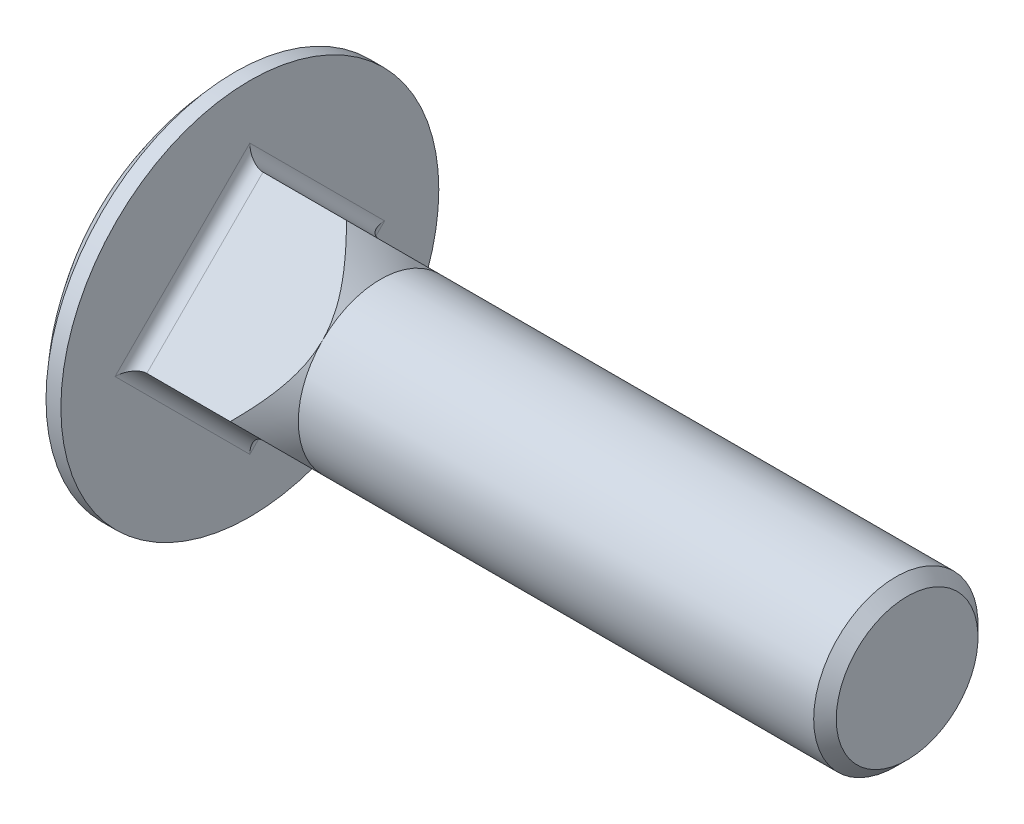
ISO-10303-21;
HEADER;
FILE_DESCRIPTION(('STEP AP214'),'2;1');
FILE_NAME('part.step','',(''),(''),'','','');
FILE_SCHEMA(('AUTOMOTIVE_DESIGN { 1 0 10303 214 1 1 1 1 }'));
ENDSEC;
DATA;
#1=APPLICATION_CONTEXT('core data for automotive mechanical design processes');
#2=APPLICATION_PROTOCOL_DEFINITION('international standard','automotive_design',2000,#1);
#3=PRODUCT_CONTEXT('',#1,'mechanical');
#4=PRODUCT('Part','Part','',(#3));
#5=PRODUCT_RELATED_PRODUCT_CATEGORY('part','',(#4));
#6=PRODUCT_DEFINITION_FORMATION('','',#4);
#7=PRODUCT_DEFINITION_CONTEXT('part definition',#1,'design');
#8=PRODUCT_DEFINITION('design','',#6,#7);
#9=PRODUCT_DEFINITION_SHAPE('','',#8);
#10=(LENGTH_UNIT() NAMED_UNIT(*) SI_UNIT(.MILLI.,.METRE.));
#11=(NAMED_UNIT(*) PLANE_ANGLE_UNIT() SI_UNIT($,.RADIAN.));
#12=(NAMED_UNIT(*) SI_UNIT($,.STERADIAN.) SOLID_ANGLE_UNIT());
#13=UNCERTAINTY_MEASURE_WITH_UNIT(LENGTH_MEASURE(1.E-05),#10,'distance_accuracy_value','');
#14=(GEOMETRIC_REPRESENTATION_CONTEXT(3) GLOBAL_UNCERTAINTY_ASSIGNED_CONTEXT((#13)) GLOBAL_UNIT_ASSIGNED_CONTEXT((#10,
#11,#12)) REPRESENTATION_CONTEXT('',''));
#15=CARTESIAN_POINT('',(0.,0.,0.));
#16=DIRECTION('',(0.,0.,1.));
#17=DIRECTION('',(1.,0.,0.));
#18=AXIS2_PLACEMENT_3D('',#15,#16,#17);
#19=CARTESIAN_POINT('',(26.8,0.,14.1421356237309));
#20=DIRECTION('',(0.,-0.707106781186548,-0.707106781186548));
#21=DIRECTION('',(0.,0.707106781186548,-0.707106781186548));
#22=AXIS2_PLACEMENT_3D('',#19,#20,#21);
#23=PLANE('',#22);
#24=DIRECTION('',(-1.,0.,0.));
#25=VECTOR('',#24,1.);
#26=CARTESIAN_POINT('',(26.8,14.1421356237309,0.));
#27=LINE('',#26,#25);
#28=CARTESIAN_POINT('',(22.6578643762691,14.1421356237309,0.));
#29=VERTEX_POINT('',#28);
#30=CARTESIAN_POINT('',(12.5,14.1421356237309,0.));
#31=VERTEX_POINT('',#30);
#32=EDGE_CURVE('E114',#29,#31,#27,.T.);
#33=ORIENTED_EDGE('',*,*,#32,.T.);
#34=DIRECTION('',(0.,0.707106781186548,-0.707106781186548));
#35=VECTOR('',#34,1.);
#36=CARTESIAN_POINT('',(12.5,0.,14.1421356237309));
#37=LINE('',#36,#35);
#38=CARTESIAN_POINT('',(12.5,0.,14.1421356237309));
#39=VERTEX_POINT('',#38);
#40=EDGE_CURVE('E207',#31,#39,#37,.F.);
#41=ORIENTED_EDGE('',*,*,#40,.T.);
#42=DIRECTION('',(-1.,0.,0.));
#43=VECTOR('',#42,1.);
#44=CARTESIAN_POINT('',(26.8,0.,14.1421356237309));
#45=LINE('',#44,#43);
#46=CARTESIAN_POINT('',(22.6578643762691,0.,14.1421356237309));
#47=VERTEX_POINT('',#46);
#48=EDGE_CURVE('E136',#47,#39,#45,.T.);
#49=ORIENTED_EDGE('',*,*,#48,.F.);
#50=CARTESIAN_POINT('',(22.6576643748549,14.1423356237309,-0.000199999999999029));
#51=CARTESIAN_POINT('',(22.8552392283487,13.9446994666429,0.197436157088054));
#52=CARTESIAN_POINT('',(23.0501556641655,13.7457030921676,0.396432531563339));
#53=CARTESIAN_POINT('',(23.4333984633262,13.3444369594801,0.797698664250814));
#54=CARTESIAN_POINT('',(23.6217218239552,13.1421657695887,0.999969854142291));
#55=CARTESIAN_POINT('',(23.9926271803843,12.7314246407346,1.41071098299635));
#56=CARTESIAN_POINT('',(24.1751080796743,12.5229088328005,1.61922679093046));
#57=CARTESIAN_POINT('',(24.5298995073007,12.1016083728509,2.04052725088003));
#58=CARTESIAN_POINT('',(24.7022111978711,11.8888242124024,2.25331141132851));
#59=CARTESIAN_POINT('',(25.0394769309558,11.4516566328823,2.69047899084863));
#60=CARTESIAN_POINT('',(25.2040327665689,11.2271185346916,2.91501708903939));
#61=CARTESIAN_POINT('',(25.5164765471425,10.7722142378568,3.36992138587418));
#62=CARTESIAN_POINT('',(25.6643613255501,10.5418469421375,3.60028868159347));
#63=CARTESIAN_POINT('',(25.9385679105803,10.0760560019902,4.06607962174076));
#64=CARTESIAN_POINT('',(26.0649930308742,9.84066310428535,4.3014725194456));
#65=CARTESIAN_POINT('',(26.2922366284796,9.36384804521957,4.77828757851138));
#66=CARTESIAN_POINT('',(26.3930711974024,9.1224297781097,5.01970584562125));
#67=CARTESIAN_POINT('',(26.5594298218964,8.64734642981096,5.49478919391998));
#68=CARTESIAN_POINT('',(26.6265684911894,8.41396806419352,5.72816755953743));
#69=CARTESIAN_POINT('',(26.7294988996792,7.94365931944244,6.19847630428851));
#70=CARTESIAN_POINT('',(26.7652837903487,7.70672817577374,6.43540744795721));
#71=CARTESIAN_POINT('',(26.8027880976449,7.23483443639357,6.90730118733738));
#72=CARTESIAN_POINT('',(26.8049784399421,6.99989086408195,7.14224475964899));
#73=CARTESIAN_POINT('',(26.776351053315,6.53102922546276,7.61110639826819));
#74=CARTESIAN_POINT('',(26.7455331671974,6.29711116404425,7.8450244596867));
#75=CARTESIAN_POINT('',(26.6532636480021,5.83397829250257,8.30815733122838));
#76=CARTESIAN_POINT('',(26.5920192159764,5.60474244237851,8.53739318135243));
#77=CARTESIAN_POINT('',(26.4425106057619,5.15076036382533,8.99137525990561));
#78=CARTESIAN_POINT('',(26.3542429126702,4.92601472348903,9.21612090024191));
#79=CARTESIAN_POINT('',(26.153488687891,4.47883245936657,9.66330316436437));
#80=CARTESIAN_POINT('',(26.0407010015051,4.25646429189013,9.88567133184082));
#81=CARTESIAN_POINT('',(25.7957378468811,3.81720389756956,10.3249317261614));
#82=CARTESIAN_POINT('',(25.6635628046939,3.60031155051314,10.5418240732178));
#83=CARTESIAN_POINT('',(25.325134016844,3.08247770866529,11.0596579150657));
#84=CARTESIAN_POINT('',(25.1109497942153,2.78414006303691,11.357995560694));
#85=CARTESIAN_POINT('',(24.6590340381723,2.19639988711076,11.9457357366202));
#86=CARTESIAN_POINT('',(24.4212871839925,1.90700333296593,12.235132290765));
#87=CARTESIAN_POINT('',(24.0552264472503,1.48299272957831,12.6591428941526));
#88=CARTESIAN_POINT('',(23.9336313955666,1.34544247647458,12.7966931472564));
#89=CARTESIAN_POINT('',(23.6868013677934,1.07197750453633,13.0701581191946));
#90=CARTESIAN_POINT('',(23.5615663032384,0.936062825565895,13.2060727981651));
#91=CARTESIAN_POINT('',(23.3081456578953,0.665971150459454,13.4761644732715));
#92=CARTESIAN_POINT('',(23.1799657765101,0.531791473207739,13.6103441505232));
#93=CARTESIAN_POINT('',(22.9208176363549,0.264803454716262,13.8773321690147));
#94=CARTESIAN_POINT('',(22.7898496478111,0.131994982414042,14.0101406413169));
#95=CARTESIAN_POINT('',(22.6576643748549,-0.000200000000001505,14.1423356237309));
#96=B_SPLINE_CURVE_WITH_KNOTS('',3,(#50,#51,#52,#53,#54,#55,#56,#57,#58,#59,#60,#61,#62,#63,#64,
#65,#66,#67,#68,#69,#70,#71,#72,#73,#74,#75,#76,#77,#78,#79,#80,#81,#82,#83,#84,#85,#86,#87,#88,
#89,#90,#91,#92,#93,#94,#95),.UNSPECIFIED.,.F.,.F.,(4,2,2,2,2,2,2,2,2,2,2,2,2,2,2,2,2,2,2,2,2,2,
4),(0.,1.02687972356315,2.05422119567216,3.09439498893963,4.13444967010763,5.20700647683827,
6.27976666632527,7.3472059901858,8.41397242439995,9.42305133747884,10.4323506062297,
11.4274884598788,12.4226310526426,13.4110878709944,14.3996733121294,15.4011657056799,
16.4026360940232,17.8210687220063,19.2404297629662,19.9286061302981,20.6167992368238,
21.3037570942602,21.990648671472),.UNSPECIFIED.);
#97=CARTESIAN_POINT('',(26.8,7.07106781186547,7.07106781186547));
#98=VERTEX_POINT('',#97);
#99=EDGE_CURVE('E115',#98,#47,#96,.T.);
#100=ORIENTED_EDGE('',*,*,#99,.F.);
#101=EDGE_CURVE('E102',#29,#98,#96,.T.);
#102=ORIENTED_EDGE('',*,*,#101,.F.);
#103=EDGE_LOOP('',(#33,#41,#49,#100,#102));
#104=FACE_BOUND('',#103,.T.);
#105=ADVANCED_FACE('F34',(#104),#23,.F.);
#106=CARTESIAN_POINT('',(26.8,-14.1421356237309,0.));
#107=DIRECTION('',(0.,0.707106781186548,-0.707106781186548));
#108=DIRECTION('',(0.,0.707106781186548,0.707106781186548));
#109=AXIS2_PLACEMENT_3D('',#106,#107,#108);
#110=PLANE('',#109);
#111=ORIENTED_EDGE('',*,*,#48,.T.);
#112=DIRECTION('',(0.,0.707106781186548,0.707106781186548));
#113=VECTOR('',#112,1.);
#114=CARTESIAN_POINT('',(12.5,-14.1421356237309,0.));
#115=LINE('',#114,#113);
#116=CARTESIAN_POINT('',(12.5,-14.1421356237309,0.));
#117=VERTEX_POINT('',#116);
#118=EDGE_CURVE('E58',#39,#117,#115,.F.);
#119=ORIENTED_EDGE('',*,*,#118,.T.);
#120=DIRECTION('',(-1.,0.,0.));
#121=VECTOR('',#120,1.);
#122=CARTESIAN_POINT('',(26.8,-14.1421356237309,0.));
#123=LINE('',#122,#121);
#124=CARTESIAN_POINT('',(22.6578643762691,-14.1421356237309,0.));
#125=VERTEX_POINT('',#124);
#126=EDGE_CURVE('E183',#125,#117,#123,.T.);
#127=ORIENTED_EDGE('',*,*,#126,.F.);
#128=CARTESIAN_POINT('',(22.6576643748549,0.000199999999999688,14.1423356237309));
#129=CARTESIAN_POINT('',(22.8552392283487,-0.197436157088054,13.9446994666429));
#130=CARTESIAN_POINT('',(23.0501556641655,-0.396432531563339,13.7457030921676));
#131=CARTESIAN_POINT('',(23.4333984633262,-0.797698664250814,13.3444369594801));
#132=CARTESIAN_POINT('',(23.6217218239552,-0.999969854142291,13.1421657695887));
#133=CARTESIAN_POINT('',(23.9926271803843,-1.41071098299635,12.7314246407346));
#134=CARTESIAN_POINT('',(24.1751080796743,-1.61922679093046,12.5229088328005));
#135=CARTESIAN_POINT('',(24.5298995073007,-2.04052725088003,12.1016083728509));
#136=CARTESIAN_POINT('',(24.7022111978711,-2.25331141132851,11.8888242124024));
#137=CARTESIAN_POINT('',(25.0394769309558,-2.69047899084863,11.4516566328823));
#138=CARTESIAN_POINT('',(25.2040327665689,-2.91501708903939,11.2271185346916));
#139=CARTESIAN_POINT('',(25.5164765471425,-3.36992138587419,10.7722142378568));
#140=CARTESIAN_POINT('',(25.6643613255501,-3.60028868159348,10.5418469421375));
#141=CARTESIAN_POINT('',(25.9385679105803,-4.06607962174077,10.0760560019902));
#142=CARTESIAN_POINT('',(26.0649930308742,-4.3014725194456,9.84066310428535));
#143=CARTESIAN_POINT('',(26.2922366284796,-4.77828757851138,9.36384804521956));
#144=CARTESIAN_POINT('',(26.3930711974024,-5.01970584562125,9.12242977810969));
#145=CARTESIAN_POINT('',(26.5594298218964,-5.49478919391999,8.64734642981096));
#146=CARTESIAN_POINT('',(26.6265684911894,-5.72816755953743,8.41396806419351));
#147=CARTESIAN_POINT('',(26.7294988996792,-6.19847630428851,7.94365931944243));
#148=CARTESIAN_POINT('',(26.7652837903487,-6.43540744795721,7.70672817577373));
#149=CARTESIAN_POINT('',(26.8027880976449,-6.90730118733738,7.23483443639357));
#150=CARTESIAN_POINT('',(26.8049784399421,-7.142244759649,6.99989086408195));
#151=CARTESIAN_POINT('',(26.776351053315,-7.61110639826819,6.53102922546276));
#152=CARTESIAN_POINT('',(26.7455331671974,-7.8450244596867,6.29711116404424));
#153=CARTESIAN_POINT('',(26.6532636480021,-8.30815733122838,5.83397829250256));
#154=CARTESIAN_POINT('',(26.5920192159764,-8.53739318135244,5.60474244237851));
#155=CARTESIAN_POINT('',(26.4425106057619,-8.99137525990562,5.15076036382533));
#156=CARTESIAN_POINT('',(26.3542429126702,-9.21612090024192,4.92601472348903));
#157=CARTESIAN_POINT('',(26.153488687891,-9.66330316436438,4.47883245936657));
#158=CARTESIAN_POINT('',(26.0407010015051,-9.88567133184082,4.25646429189013));
#159=CARTESIAN_POINT('',(25.7957378468811,-10.3249317261614,3.81720389756955));
#160=CARTESIAN_POINT('',(25.6635628046939,-10.5418240732178,3.60031155051314));
#161=CARTESIAN_POINT('',(25.325134016844,-11.0596579150657,3.08247770866529));
#162=CARTESIAN_POINT('',(25.1109497942153,-11.357995560694,2.78414006303691));
#163=CARTESIAN_POINT('',(24.6590340381723,-11.9457357366202,2.19639988711075));
#164=CARTESIAN_POINT('',(24.4212871839925,-12.235132290765,1.90700333296592));
#165=CARTESIAN_POINT('',(24.0552264472503,-12.6591428941526,1.4829927295783));
#166=CARTESIAN_POINT('',(23.9336313955666,-12.7966931472564,1.34544247647458));
#167=CARTESIAN_POINT('',(23.6868013677934,-13.0701581191946,1.07197750453633));
#168=CARTESIAN_POINT('',(23.5615663032384,-13.2060727981651,0.936062825565892));
#169=CARTESIAN_POINT('',(23.3081456578953,-13.4761644732715,0.665971150459451));
#170=CARTESIAN_POINT('',(23.1799657765101,-13.6103441505232,0.531791473207737));
#171=CARTESIAN_POINT('',(22.9208176363549,-13.8773321690147,0.264803454716261));
#172=CARTESIAN_POINT('',(22.7898496478111,-14.0101406413169,0.131994982414043));
#173=CARTESIAN_POINT('',(22.6576643748549,-14.1423356237309,-0.000200000000000785));
#174=B_SPLINE_CURVE_WITH_KNOTS('',3,(#128,#129,#130,#131,#132,#133,#134,#135,#136,#137,#138,
#139,#140,#141,#142,#143,#144,#145,#146,#147,#148,#149,#150,#151,#152,#153,#154,#155,#156,#157,
#158,#159,#160,#161,#162,#163,#164,#165,#166,#167,#168,#169,#170,#171,#172,#173),.UNSPECIFIED.,
.F.,.F.,(4,2,2,2,2,2,2,2,2,2,2,2,2,2,2,2,2,2,2,2,2,2,4),(0.,1.02687972356315,2.05422119567216,
3.09439498893963,4.13444967010763,5.20700647683827,6.27976666632527,7.3472059901858,
8.41397242439996,9.42305133747884,10.4323506062297,11.4274884598788,12.4226310526426,
13.4110878709944,14.3996733121294,15.4011657056799,16.4026360940232,17.8210687220063,
19.2404297629662,19.9286061302981,20.6167992368238,21.3037570942602,21.990648671472),.UNSPECIFIED.);
#175=CARTESIAN_POINT('',(26.8,-7.07106781186547,7.07106781186547));
#176=VERTEX_POINT('',#175);
#177=EDGE_CURVE('E137',#176,#125,#174,.T.);
#178=ORIENTED_EDGE('',*,*,#177,.F.);
#179=EDGE_CURVE('E123',#47,#176,#174,.T.);
#180=ORIENTED_EDGE('',*,*,#179,.F.);
#181=EDGE_LOOP('',(#111,#119,#127,#178,#180));
#182=FACE_BOUND('',#181,.T.);
#183=ADVANCED_FACE('F176',(#182),#110,.F.);
#184=CARTESIAN_POINT('',(26.8,0.,-14.1421356237309));
#185=DIRECTION('',(0.,0.707106781186548,0.707106781186548));
#186=DIRECTION('',(0.,-0.707106781186548,0.707106781186548));
#187=AXIS2_PLACEMENT_3D('',#184,#185,#186);
#188=PLANE('',#187);
#189=ORIENTED_EDGE('',*,*,#126,.T.);
#190=DIRECTION('',(0.,-0.707106781186548,0.707106781186548));
#191=VECTOR('',#190,1.);
#192=CARTESIAN_POINT('',(12.5,0.,-14.1421356237309));
#193=LINE('',#192,#191);
#194=CARTESIAN_POINT('',(12.5,0.,-14.1421356237309));
#195=VERTEX_POINT('',#194);
#196=EDGE_CURVE('E43',#117,#195,#193,.F.);
#197=ORIENTED_EDGE('',*,*,#196,.T.);
#198=DIRECTION('',(-1.,0.,0.));
#199=VECTOR('',#198,1.);
#200=CARTESIAN_POINT('',(26.8,0.,-14.1421356237309));
#201=LINE('',#200,#199);
#202=CARTESIAN_POINT('',(22.6578643762691,0.,-14.1421356237309));
#203=VERTEX_POINT('',#202);
#204=EDGE_CURVE('E188',#203,#195,#201,.T.);
#205=ORIENTED_EDGE('',*,*,#204,.F.);
#206=CARTESIAN_POINT('',(22.6576643748549,-14.1423356237309,0.000199999999999463));
#207=CARTESIAN_POINT('',(22.8552392283487,-13.9446994666429,-0.197436157088053));
#208=CARTESIAN_POINT('',(23.0501556641655,-13.7457030921676,-0.396432531563338));
#209=CARTESIAN_POINT('',(23.4333984633262,-13.3444369594801,-0.797698664250813));
#210=CARTESIAN_POINT('',(23.6217218239552,-13.1421657695887,-0.99996985414229));
#211=CARTESIAN_POINT('',(23.9926271803843,-12.7314246407346,-1.41071098299635));
#212=CARTESIAN_POINT('',(24.1751080796743,-12.5229088328005,-1.61922679093046));
#213=CARTESIAN_POINT('',(24.5298995073007,-12.1016083728509,-2.04052725088003));
#214=CARTESIAN_POINT('',(24.7022111978711,-11.8888242124024,-2.25331141132851));
#215=CARTESIAN_POINT('',(25.0394769309558,-11.4516566328823,-2.69047899084863));
#216=CARTESIAN_POINT('',(25.2040327665689,-11.2271185346916,-2.91501708903939));
#217=CARTESIAN_POINT('',(25.5164765471425,-10.7722142378568,-3.36992138587419));
#218=CARTESIAN_POINT('',(25.6643613255501,-10.5418469421375,-3.60028868159348));
#219=CARTESIAN_POINT('',(25.9385679105803,-10.0760560019902,-4.06607962174077));
#220=CARTESIAN_POINT('',(26.0649930308742,-9.84066310428534,-4.3014725194456));
#221=CARTESIAN_POINT('',(26.2922366284796,-9.36384804521956,-4.77828757851139));
#222=CARTESIAN_POINT('',(26.3930711974024,-9.12242977810969,-5.01970584562125));
#223=CARTESIAN_POINT('',(26.5594298218964,-8.64734642981096,-5.49478919391999));
#224=CARTESIAN_POINT('',(26.6265684911894,-8.41396806419352,-5.72816755953743));
#225=CARTESIAN_POINT('',(26.7294988996792,-7.94365931944244,-6.19847630428851));
#226=CARTESIAN_POINT('',(26.7652837903487,-7.70672817577373,-6.43540744795721));
#227=CARTESIAN_POINT('',(26.8027880976449,-7.23483443639357,-6.90730118733738));
#228=CARTESIAN_POINT('',(26.8049784399421,-6.99989086408195,-7.142244759649));
#229=CARTESIAN_POINT('',(26.776351053315,-6.53102922546276,-7.61110639826819));
#230=CARTESIAN_POINT('',(26.7455331671974,-6.29711116404424,-7.8450244596867));
#231=CARTESIAN_POINT('',(26.6532636480021,-5.83397829250256,-8.30815733122838));
#232=CARTESIAN_POINT('',(26.5920192159764,-5.60474244237851,-8.53739318135244));
#233=CARTESIAN_POINT('',(26.4425106057619,-5.15076036382533,-8.99137525990562));
#234=CARTESIAN_POINT('',(26.3542429126702,-4.92601472348903,-9.21612090024192));
#235=CARTESIAN_POINT('',(26.153488687891,-4.47883245936657,-9.66330316436438));
#236=CARTESIAN_POINT('',(26.0407010015051,-4.25646429189012,-9.88567133184082));
#237=CARTESIAN_POINT('',(25.7957378468811,-3.81720389756955,-10.3249317261614));
#238=CARTESIAN_POINT('',(25.6635628046939,-3.60031155051314,-10.5418240732178));
#239=CARTESIAN_POINT('',(25.325134016844,-3.08247770866529,-11.0596579150657));
#240=CARTESIAN_POINT('',(25.1109497942153,-2.78414006303691,-11.357995560694));
#241=CARTESIAN_POINT('',(24.6590340381723,-2.19639988711075,-11.9457357366202));
#242=CARTESIAN_POINT('',(24.4212871839925,-1.90700333296592,-12.235132290765));
#243=CARTESIAN_POINT('',(24.0552264472503,-1.4829927295783,-12.6591428941526));
#244=CARTESIAN_POINT('',(23.9336313955666,-1.34544247647458,-12.7966931472564));
#245=CARTESIAN_POINT('',(23.6868013677934,-1.07197750453632,-13.0701581191946));
#246=CARTESIAN_POINT('',(23.5615663032384,-0.936062825565891,-13.2060727981651));
#247=CARTESIAN_POINT('',(23.3081456578953,-0.66597115045945,-13.4761644732715));
#248=CARTESIAN_POINT('',(23.1799657765101,-0.531791473207736,-13.6103441505232));
#249=CARTESIAN_POINT('',(22.9208176363549,-0.26480345471626,-13.8773321690147));
#250=CARTESIAN_POINT('',(22.7898496478111,-0.13199498241404,-14.0101406413169));
#251=CARTESIAN_POINT('',(22.6576643748549,0.000200000000004266,-14.142335623731));
#252=B_SPLINE_CURVE_WITH_KNOTS('',3,(#206,#207,#208,#209,#210,#211,#212,#213,#214,#215,#216,
#217,#218,#219,#220,#221,#222,#223,#224,#225,#226,#227,#228,#229,#230,#231,#232,#233,#234,#235,
#236,#237,#238,#239,#240,#241,#242,#243,#244,#245,#246,#247,#248,#249,#250,#251),.UNSPECIFIED.,
.F.,.F.,(4,2,2,2,2,2,2,2,2,2,2,2,2,2,2,2,2,2,2,2,2,2,4),(0.,1.02687972356315,2.05422119567216,
3.09439498893963,4.13444967010764,5.20700647683828,6.27976666632528,7.34720599018581,
8.41397242439996,9.42305133747884,10.4323506062297,11.4274884598788,12.4226310526426,
13.4110878709944,14.3996733121294,15.4011657056799,16.4026360940232,17.8210687220063,
19.2404297629662,19.9286061302982,20.6167992368238,21.3037570942602,21.990648671472),.UNSPECIFIED.);
#253=CARTESIAN_POINT('',(26.8,-7.07106781186547,-7.07106781186547));
#254=VERTEX_POINT('',#253);
#255=EDGE_CURVE('E167',#254,#203,#252,.T.);
#256=ORIENTED_EDGE('',*,*,#255,.F.);
#257=EDGE_CURVE('E171',#125,#254,#252,.T.);
#258=ORIENTED_EDGE('',*,*,#257,.F.);
#259=EDGE_LOOP('',(#189,#197,#205,#256,#258));
#260=FACE_BOUND('',#259,.T.);
#261=ADVANCED_FACE('F173',(#260),#188,.F.);
#262=CARTESIAN_POINT('',(26.8,14.1421356237309,0.));
#263=DIRECTION('',(0.,-0.707106781186548,0.707106781186548));
#264=DIRECTION('',(0.,-0.707106781186548,-0.707106781186548));
#265=AXIS2_PLACEMENT_3D('',#262,#263,#264);
#266=PLANE('',#265);
#267=ORIENTED_EDGE('',*,*,#204,.T.);
#268=DIRECTION('',(0.,-0.707106781186548,-0.707106781186548));
#269=VECTOR('',#268,1.);
#270=CARTESIAN_POINT('',(12.5,14.1421356237309,0.));
#271=LINE('',#270,#269);
#272=EDGE_CURVE('E11',#195,#31,#271,.F.);
#273=ORIENTED_EDGE('',*,*,#272,.T.);
#274=ORIENTED_EDGE('',*,*,#32,.F.);
#275=CARTESIAN_POINT('',(22.6576643748549,-0.000200000000000312,-14.1423356237309));
#276=CARTESIAN_POINT('',(22.8552392283487,0.197436157088053,-13.9446994666429));
#277=CARTESIAN_POINT('',(23.0501556641655,0.396432531563339,-13.7457030921676));
#278=CARTESIAN_POINT('',(23.4333984633262,0.797698664250815,-13.3444369594801));
#279=CARTESIAN_POINT('',(23.6217218239552,0.999969854142293,-13.1421657695887));
#280=CARTESIAN_POINT('',(23.9926271803843,1.41071098299636,-12.7314246407346));
#281=CARTESIAN_POINT('',(24.1751080796743,1.61922679093047,-12.5229088328005));
#282=CARTESIAN_POINT('',(24.5298995073007,2.04052725088003,-12.1016083728509));
#283=CARTESIAN_POINT('',(24.7022111978711,2.25331141132851,-11.8888242124024));
#284=CARTESIAN_POINT('',(25.0394769309558,2.69047899084864,-11.4516566328823));
#285=CARTESIAN_POINT('',(25.2040327665689,2.91501708903939,-11.2271185346916));
#286=CARTESIAN_POINT('',(25.5164765471425,3.36992138587419,-10.7722142378568));
#287=CARTESIAN_POINT('',(25.6643613255501,3.60028868159348,-10.5418469421375));
#288=CARTESIAN_POINT('',(25.9385679105803,4.06607962174076,-10.0760560019902));
#289=CARTESIAN_POINT('',(26.0649930308742,4.3014725194456,-9.84066310428535));
#290=CARTESIAN_POINT('',(26.2922366284796,4.77828757851138,-9.36384804521956));
#291=CARTESIAN_POINT('',(26.3930711974024,5.01970584562125,-9.12242977810969));
#292=CARTESIAN_POINT('',(26.5594298218964,5.49478919391999,-8.64734642981096));
#293=CARTESIAN_POINT('',(26.6265684911894,5.72816755953743,-8.41396806419352));
#294=CARTESIAN_POINT('',(26.7294988996792,6.19847630428851,-7.94365931944244));
#295=CARTESIAN_POINT('',(26.7652837903487,6.43540744795721,-7.70672817577373));
#296=CARTESIAN_POINT('',(26.8027880976449,6.90730118733738,-7.23483443639357));
#297=CARTESIAN_POINT('',(26.8049784399421,7.142244759649,-6.99989086408195));
#298=CARTESIAN_POINT('',(26.776351053315,7.61110639826819,-6.53102922546276));
#299=CARTESIAN_POINT('',(26.7455331671974,7.8450244596867,-6.29711116404424));
#300=CARTESIAN_POINT('',(26.6532636480021,8.30815733122838,-5.83397829250256));
#301=CARTESIAN_POINT('',(26.5920192159764,8.53739318135244,-5.60474244237851));
#302=CARTESIAN_POINT('',(26.4425106057619,8.99137525990562,-5.15076036382533));
#303=CARTESIAN_POINT('',(26.3542429126702,9.21612090024192,-4.92601472348903));
#304=CARTESIAN_POINT('',(26.153488687891,9.66330316436438,-4.47883245936656));
#305=CARTESIAN_POINT('',(26.0407010015051,9.88567133184082,-4.25646429189012));
#306=CARTESIAN_POINT('',(25.7957378468811,10.3249317261614,-3.81720389756955));
#307=CARTESIAN_POINT('',(25.6635628046939,10.5418240732178,-3.60031155051313));
#308=CARTESIAN_POINT('',(25.325134016844,11.0596579150657,-3.08247770866529));
#309=CARTESIAN_POINT('',(25.1109497942153,11.357995560694,-2.78414006303691));
#310=CARTESIAN_POINT('',(24.6590340381723,11.9457357366202,-2.19639988711076));
#311=CARTESIAN_POINT('',(24.4212871839925,12.235132290765,-1.90700333296593));
#312=CARTESIAN_POINT('',(24.0552264472503,12.6591428941526,-1.48299272957831));
#313=CARTESIAN_POINT('',(23.9336313955666,12.7966931472564,-1.34544247647458));
#314=CARTESIAN_POINT('',(23.6868013677934,13.0701581191946,-1.07197750453633));
#315=CARTESIAN_POINT('',(23.5615663032384,13.2060727981651,-0.936062825565894));
#316=CARTESIAN_POINT('',(23.3081456578953,13.4761644732715,-0.665971150459452));
#317=CARTESIAN_POINT('',(23.1799657765101,13.6103441505232,-0.531791473207737));
#318=CARTESIAN_POINT('',(22.9208176363549,13.8773321690147,-0.264803454716261));
#319=CARTESIAN_POINT('',(22.7898496478111,14.0101406413169,-0.131994982414042));
#320=CARTESIAN_POINT('',(22.6576643748549,14.1423356237309,0.000200000000001478));
#321=B_SPLINE_CURVE_WITH_KNOTS('',3,(#275,#276,#277,#278,#279,#280,#281,#282,#283,#284,#285,
#286,#287,#288,#289,#290,#291,#292,#293,#294,#295,#296,#297,#298,#299,#300,#301,#302,#303,#304,
#305,#306,#307,#308,#309,#310,#311,#312,#313,#314,#315,#316,#317,#318,#319,#320),.UNSPECIFIED.,
.F.,.F.,(4,2,2,2,2,2,2,2,2,2,2,2,2,2,2,2,2,2,2,2,2,2,4),(0.,1.02687972356316,2.05422119567216,
3.09439498893963,4.13444967010763,5.20700647683828,6.27976666632527,7.34720599018581,
8.41397242439996,9.42305133747884,10.4323506062297,11.4274884598788,12.4226310526426,
13.4110878709944,14.3996733121294,15.4011657056799,16.4026360940232,17.8210687220063,
19.2404297629662,19.9286061302982,20.6167992368238,21.3037570942602,21.990648671472),.UNSPECIFIED.);
#322=CARTESIAN_POINT('',(26.8,7.07106781186547,-7.07106781186547));
#323=VERTEX_POINT('',#322);
#324=EDGE_CURVE('E109',#323,#29,#321,.T.);
#325=ORIENTED_EDGE('',*,*,#324,.F.);
#326=EDGE_CURVE('E172',#203,#323,#321,.T.);
#327=ORIENTED_EDGE('',*,*,#326,.F.);
#328=EDGE_LOOP('',(#267,#273,#274,#325,#327));
#329=FACE_BOUND('',#328,.T.);
#330=ADVANCED_FACE('F157',(#329),#266,.F.);
#331=CARTESIAN_POINT('',(33.641289263635,0.,0.));
#332=DIRECTION('',(-1.,0.,0.));
#333=DIRECTION('',(0.,1.,0.));
#334=AXIS2_PLACEMENT_3D('',#331,#332,#333);
#335=SPHERICAL_SURFACE('',#334,33.641289263635);
#336=CARTESIAN_POINT('',(9.09059999999999,0.,0.));
#337=DIRECTION('',(-1.,0.,0.));
#338=DIRECTION('',(0.,0.,1.));
#339=AXIS2_PLACEMENT_3D('',#336,#337,#338);
#340=CIRCLE('',#339,23.);
#341=CARTESIAN_POINT('',(9.09059999999999,0.,23.));
#342=VERTEX_POINT('',#341);
#343=EDGE_CURVE('E182',#342,#342,#340,.T.);
#344=ORIENTED_EDGE('',*,*,#343,.T.);
#345=EDGE_LOOP('',(#344));
#346=FACE_BOUND('',#345,.T.);
#347=ADVANCED_FACE('F247',(#346),#335,.T.);
#348=CARTESIAN_POINT('',(-31.75,0.,0.));
#349=DIRECTION('',(-1.,0.,0.));
#350=DIRECTION('',(0.,0.,1.));
#351=AXIS2_PLACEMENT_3D('',#348,#349,#350);
#352=CYLINDRICAL_SURFACE('',#351,23.);
#353=CARTESIAN_POINT('',(10.9,0.,0.));
#354=DIRECTION('',(-1.,0.,0.));
#355=DIRECTION('',(0.,0.,1.));
#356=AXIS2_PLACEMENT_3D('',#353,#354,#355);
#357=CIRCLE('',#356,23.);
#358=CARTESIAN_POINT('',(10.9,0.,23.));
#359=VERTEX_POINT('',#358);
#360=EDGE_CURVE('E186',#359,#359,#357,.T.);
#361=ORIENTED_EDGE('',*,*,#360,.T.);
#362=EDGE_LOOP('',(#361));
#363=FACE_BOUND('',#362,.T.);
#364=ORIENTED_EDGE('',*,*,#343,.F.);
#365=EDGE_LOOP('',(#364));
#366=FACE_BOUND('',#365,.T.);
#367=ADVANCED_FACE('F250',(#363,#366),#352,.T.);
#368=CARTESIAN_POINT('',(10.9,23.,0.));
#369=DIRECTION('',(1.,0.,0.));
#370=DIRECTION('',(0.,0.,-1.));
#371=AXIS2_PLACEMENT_3D('',#368,#369,#370);
#372=PLANE('',#371);
#373=DIRECTION('',(0.,0.707106781186548,0.707106781186548));
#374=VECTOR('',#373,1.);
#375=CARTESIAN_POINT('',(10.9,3.29756133823605,19.7024386617639));
#376=LINE('',#375,#374);
#377=CARTESIAN_POINT('',(10.9,-16.4048773235279,0.));
#378=VERTEX_POINT('',#377);
#379=CARTESIAN_POINT('',(10.9,0.,16.4048773235279));
#380=VERTEX_POINT('',#379);
#381=EDGE_CURVE('E202',#378,#380,#376,.T.);
#382=ORIENTED_EDGE('',*,*,#381,.T.);
#383=DIRECTION('',(0.,0.707106781186548,-0.707106781186548));
#384=VECTOR('',#383,1.);
#385=CARTESIAN_POINT('',(10.9,19.702438661764,-3.29756133823605));
#386=LINE('',#385,#384);
#387=CARTESIAN_POINT('',(10.9,16.4048773235279,0.));
#388=VERTEX_POINT('',#387);
#389=EDGE_CURVE('E204',#380,#388,#386,.T.);
#390=ORIENTED_EDGE('',*,*,#389,.T.);
#391=DIRECTION('',(0.,-0.707106781186548,-0.707106781186548));
#392=VECTOR('',#391,1.);
#393=CARTESIAN_POINT('',(10.9,19.7024386617639,3.29756133823605));
#394=LINE('',#393,#392);
#395=CARTESIAN_POINT('',(10.9,0.,-16.4048773235279));
#396=VERTEX_POINT('',#395);
#397=EDGE_CURVE('E198',#388,#396,#394,.T.);
#398=ORIENTED_EDGE('',*,*,#397,.T.);
#399=DIRECTION('',(0.,-0.707106781186548,0.707106781186548));
#400=VECTOR('',#399,1.);
#401=CARTESIAN_POINT('',(10.9,3.29756133823605,-19.7024386617639));
#402=LINE('',#401,#400);
#403=EDGE_CURVE('E200',#396,#378,#402,.T.);
#404=ORIENTED_EDGE('',*,*,#403,.T.);
#405=EDGE_LOOP('',(#382,#390,#398,#404));
#406=FACE_BOUND('',#405,.T.);
#407=ORIENTED_EDGE('',*,*,#360,.F.);
#408=EDGE_LOOP('',(#407));
#409=FACE_BOUND('',#408,.T.);
#410=ADVANCED_FACE('F263',(#406,#409),#372,.T.);
#411=CARTESIAN_POINT('',(12.8000000000001,0.,0.));
#412=DIRECTION('',(-1.,0.,0.));
#413=DIRECTION('',(0.,0.,1.));
#414=AXIS2_PLACEMENT_3D('',#411,#412,#413);
#415=CONICAL_SURFACE('',#414,24.,0.78539816339745);
#416=ORIENTED_EDGE('',*,*,#99,.T.);
#417=ORIENTED_EDGE('',*,*,#179,.T.);
#418=CARTESIAN_POINT('',(26.8,0.,0.));
#419=DIRECTION('',(-1.,0.,0.));
#420=DIRECTION('',(0.,0.,1.));
#421=AXIS2_PLACEMENT_3D('',#418,#419,#420);
#422=CIRCLE('',#421,10.);
#423=EDGE_CURVE('E120',#98,#176,#422,.F.);
#424=ORIENTED_EDGE('',*,*,#423,.F.);
#425=EDGE_LOOP('',(#416,#417,#424));
#426=FACE_BOUND('',#425,.T.);
#427=ADVANCED_FACE('F121',(#426),#415,.T.);
#428=ORIENTED_EDGE('',*,*,#101,.T.);
#429=EDGE_CURVE('E106',#323,#98,#422,.F.);
#430=ORIENTED_EDGE('',*,*,#429,.F.);
#431=ORIENTED_EDGE('',*,*,#324,.T.);
#432=EDGE_LOOP('',(#428,#430,#431));
#433=FACE_BOUND('',#432,.T.);
#434=ADVANCED_FACE('F104',(#433),#415,.T.);
#435=ORIENTED_EDGE('',*,*,#255,.T.);
#436=ORIENTED_EDGE('',*,*,#326,.T.);
#437=EDGE_CURVE('E133',#254,#323,#422,.F.);
#438=ORIENTED_EDGE('',*,*,#437,.F.);
#439=EDGE_LOOP('',(#435,#436,#438));
#440=FACE_BOUND('',#439,.T.);
#441=ADVANCED_FACE('F156',(#440),#415,.T.);
#442=ORIENTED_EDGE('',*,*,#177,.T.);
#443=ORIENTED_EDGE('',*,*,#257,.T.);
#444=EDGE_CURVE('E129',#176,#254,#422,.F.);
#445=ORIENTED_EDGE('',*,*,#444,.F.);
#446=EDGE_LOOP('',(#442,#443,#445));
#447=FACE_BOUND('',#446,.T.);
#448=ADVANCED_FACE('F256',(#447),#415,.T.);
#449=CARTESIAN_POINT('',(90.9,8.626,0.));
#450=DIRECTION('',(1.,0.,0.));
#451=DIRECTION('',(0.,0.,-1.));
#452=AXIS2_PLACEMENT_3D('',#449,#450,#451);
#453=PLANE('',#452);
#454=CARTESIAN_POINT('',(90.9,0.,0.));
#455=DIRECTION('',(-1.,0.,0.));
#456=DIRECTION('',(0.,0.,1.));
#457=AXIS2_PLACEMENT_3D('',#454,#455,#456);
#458=CIRCLE('',#457,8.626);
#459=CARTESIAN_POINT('',(90.9,0.,8.626));
#460=VERTEX_POINT('',#459);
#461=EDGE_CURVE('E127',#460,#460,#458,.T.);
#462=ORIENTED_EDGE('',*,*,#461,.F.);
#463=EDGE_LOOP('',(#462));
#464=FACE_BOUND('',#463,.T.);
#465=ADVANCED_FACE('F252',(#464),#453,.T.);
#466=CARTESIAN_POINT('',(90.9,0.,0.));
#467=DIRECTION('',(-1.,0.,0.));
#468=DIRECTION('',(0.,0.,1.));
#469=AXIS2_PLACEMENT_3D('',#466,#467,#468);
#470=CONICAL_SURFACE('',#469,8.626,0.785398163397341);
#471=CARTESIAN_POINT('',(89.5259999999997,0.,0.));
#472=DIRECTION('',(-1.,0.,0.));
#473=DIRECTION('',(0.,0.,1.));
#474=AXIS2_PLACEMENT_3D('',#471,#472,#473);
#475=CIRCLE('',#474,10.);
#476=CARTESIAN_POINT('',(89.5259999999997,0.,10.));
#477=VERTEX_POINT('',#476);
#478=EDGE_CURVE('E193',#477,#477,#475,.T.);
#479=ORIENTED_EDGE('',*,*,#478,.F.);
#480=EDGE_LOOP('',(#479));
#481=FACE_BOUND('',#480,.T.);
#482=ORIENTED_EDGE('',*,*,#461,.T.);
#483=EDGE_LOOP('',(#482));
#484=FACE_BOUND('',#483,.T.);
#485=ADVANCED_FACE('F255',(#481,#484),#470,.T.);
#486=CARTESIAN_POINT('',(-31.75,0.,0.));
#487=DIRECTION('',(-1.,0.,0.));
#488=DIRECTION('',(0.,0.,1.));
#489=AXIS2_PLACEMENT_3D('',#486,#487,#488);
#490=CYLINDRICAL_SURFACE('',#489,10.);
#491=ORIENTED_EDGE('',*,*,#423,.T.);
#492=ORIENTED_EDGE('',*,*,#444,.T.);
#493=ORIENTED_EDGE('',*,*,#437,.T.);
#494=ORIENTED_EDGE('',*,*,#429,.T.);
#495=EDGE_LOOP('',(#491,#492,#493,#494));
#496=FACE_BOUND('',#495,.T.);
#497=ORIENTED_EDGE('',*,*,#478,.T.);
#498=EDGE_LOOP('',(#497));
#499=FACE_BOUND('',#498,.T.);
#500=ADVANCED_FACE('F130',(#496,#499),#490,.T.);
#501=CARTESIAN_POINT('',(12.5,3.29756133823605,-19.702438661764));
#502=DIRECTION('',(0.,-0.707106781186548,0.707106781186548));
#503=DIRECTION('',(0.,-0.707106781186548,-0.707106781186548));
#504=AXIS2_PLACEMENT_3D('',#501,#502,#503);
#505=CYLINDRICAL_SURFACE('',#504,1.6);
#506=CARTESIAN_POINT('',(12.5,0.,-16.4048773235279));
#507=DIRECTION('',(0.,-1.,0.));
#508=DIRECTION('',(0.,0.,-1.));
#509=AXIS2_PLACEMENT_3D('',#506,#507,#508);
#510=ELLIPSE('',#509,2.26274169979695,1.6);
#511=EDGE_CURVE('E214',#195,#396,#510,.T.);
#512=ORIENTED_EDGE('',*,*,#511,.F.);
#513=ORIENTED_EDGE('',*,*,#196,.F.);
#514=CARTESIAN_POINT('',(12.5,-16.4048773235279,0.));
#515=DIRECTION('',(0.,0.,1.));
#516=DIRECTION('',(0.,-1.,0.));
#517=AXIS2_PLACEMENT_3D('',#514,#515,#516);
#518=ELLIPSE('',#517,2.26274169979695,1.6);
#519=EDGE_CURVE('E38',#378,#117,#518,.F.);
#520=ORIENTED_EDGE('',*,*,#519,.F.);
#521=ORIENTED_EDGE('',*,*,#403,.F.);
#522=EDGE_LOOP('',(#512,#513,#520,#521));
#523=FACE_BOUND('',#522,.T.);
#524=ADVANCED_FACE('F36',(#523),#505,.F.);
#525=CARTESIAN_POINT('',(12.5,3.29756133823605,19.7024386617639));
#526=DIRECTION('',(0.,0.707106781186548,0.707106781186548));
#527=DIRECTION('',(0.,-0.707106781186548,0.707106781186548));
#528=AXIS2_PLACEMENT_3D('',#525,#526,#527);
#529=CYLINDRICAL_SURFACE('',#528,1.6);
#530=ORIENTED_EDGE('',*,*,#519,.T.);
#531=ORIENTED_EDGE('',*,*,#118,.F.);
#532=CARTESIAN_POINT('',(12.5,0.,16.4048773235279));
#533=DIRECTION('',(0.,1.,0.));
#534=DIRECTION('',(0.,0.,1.));
#535=AXIS2_PLACEMENT_3D('',#532,#533,#534);
#536=ELLIPSE('',#535,2.26274169979695,1.6);
#537=EDGE_CURVE('E213',#380,#39,#536,.F.);
#538=ORIENTED_EDGE('',*,*,#537,.F.);
#539=ORIENTED_EDGE('',*,*,#381,.F.);
#540=EDGE_LOOP('',(#530,#531,#538,#539));
#541=FACE_BOUND('',#540,.T.);
#542=ADVANCED_FACE('F237',(#541),#529,.F.);
#543=CARTESIAN_POINT('',(12.5,19.7024386617639,3.29756133823605));
#544=DIRECTION('',(0.,-0.707106781186548,-0.707106781186548));
#545=DIRECTION('',(0.,0.707106781186548,-0.707106781186548));
#546=AXIS2_PLACEMENT_3D('',#543,#544,#545);
#547=CYLINDRICAL_SURFACE('',#546,1.6);
#548=ORIENTED_EDGE('',*,*,#511,.T.);
#549=ORIENTED_EDGE('',*,*,#397,.F.);
#550=CARTESIAN_POINT('',(12.5,16.4048773235279,0.));
#551=DIRECTION('',(0.,0.,-1.));
#552=DIRECTION('',(0.,-1.,0.));
#553=AXIS2_PLACEMENT_3D('',#550,#551,#552);
#554=ELLIPSE('',#553,2.26274169979695,1.6);
#555=EDGE_CURVE('E211',#31,#388,#554,.T.);
#556=ORIENTED_EDGE('',*,*,#555,.F.);
#557=ORIENTED_EDGE('',*,*,#272,.F.);
#558=EDGE_LOOP('',(#548,#549,#556,#557));
#559=FACE_BOUND('',#558,.T.);
#560=ADVANCED_FACE('F232',(#559),#547,.F.);
#561=CARTESIAN_POINT('',(12.5,19.702438661764,-3.29756133823605));
#562=DIRECTION('',(0.,0.707106781186548,-0.707106781186548));
#563=DIRECTION('',(0.,0.707106781186548,0.707106781186548));
#564=AXIS2_PLACEMENT_3D('',#561,#562,#563);
#565=CYLINDRICAL_SURFACE('',#564,1.6);
#566=ORIENTED_EDGE('',*,*,#537,.T.);
#567=ORIENTED_EDGE('',*,*,#40,.F.);
#568=ORIENTED_EDGE('',*,*,#555,.T.);
#569=ORIENTED_EDGE('',*,*,#389,.F.);
#570=EDGE_LOOP('',(#566,#567,#568,#569));
#571=FACE_BOUND('',#570,.T.);
#572=ADVANCED_FACE('F235',(#571),#565,.F.);
#573=CLOSED_SHELL('',(#105,#183,#261,#330,#347,#367,#410,#427,#434,#441,#448,#465,#485,#500,
#524,#542,#560,#572));
#574=MANIFOLD_SOLID_BREP('B2',#573);
#575=ADVANCED_BREP_SHAPE_REPRESENTATION('',(#18,#574),#14);
#576=SHAPE_DEFINITION_REPRESENTATION(#9,#575);
ENDSEC;
END-ISO-10303-21;
